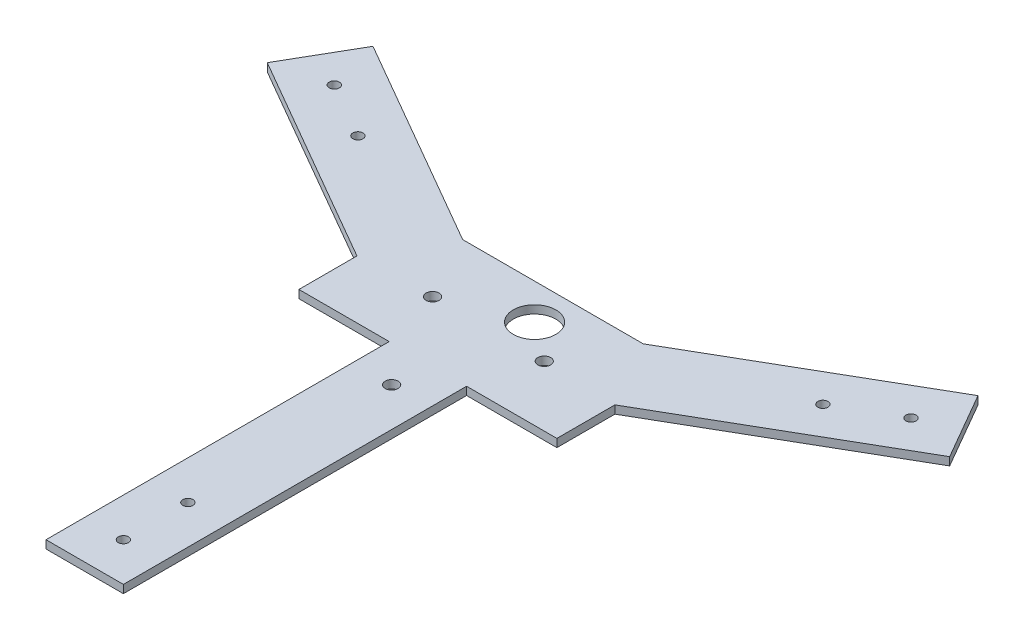
ISO-10303-21;
HEADER;
FILE_DESCRIPTION(('STEP AP214'),'2;1');
FILE_NAME('part.step','',(''),(''),'','','');
FILE_SCHEMA(('AUTOMOTIVE_DESIGN { 1 0 10303 214 1 1 1 1 }'));
ENDSEC;
DATA;
#1=APPLICATION_CONTEXT('core data for automotive mechanical design processes');
#2=APPLICATION_PROTOCOL_DEFINITION('international standard','automotive_design',2000,#1);
#3=PRODUCT_CONTEXT('',#1,'mechanical');
#4=PRODUCT('Part','Part','',(#3));
#5=PRODUCT_RELATED_PRODUCT_CATEGORY('part','',(#4));
#6=PRODUCT_DEFINITION_FORMATION('','',#4);
#7=PRODUCT_DEFINITION_CONTEXT('part definition',#1,'design');
#8=PRODUCT_DEFINITION('design','',#6,#7);
#9=PRODUCT_DEFINITION_SHAPE('','',#8);
#10=(LENGTH_UNIT() NAMED_UNIT(*) SI_UNIT(.MILLI.,.METRE.));
#11=(NAMED_UNIT(*) PLANE_ANGLE_UNIT() SI_UNIT($,.RADIAN.));
#12=(NAMED_UNIT(*) SI_UNIT($,.STERADIAN.) SOLID_ANGLE_UNIT());
#13=UNCERTAINTY_MEASURE_WITH_UNIT(LENGTH_MEASURE(1.E-05),#10,'distance_accuracy_value','');
#14=(GEOMETRIC_REPRESENTATION_CONTEXT(3) GLOBAL_UNCERTAINTY_ASSIGNED_CONTEXT((#13)) GLOBAL_UNIT_ASSIGNED_CONTEXT((#10,
#11,#12)) REPRESENTATION_CONTEXT('',''));
#15=CARTESIAN_POINT('',(0.,0.,0.));
#16=DIRECTION('',(0.,0.,1.));
#17=DIRECTION('',(1.,0.,0.));
#18=AXIS2_PLACEMENT_3D('',#15,#16,#17);
#19=CARTESIAN_POINT('',(50.8,1.5875,0.));
#20=DIRECTION('',(-1.,0.,0.));
#21=DIRECTION('',(0.,0.,1.));
#22=AXIS2_PLACEMENT_3D('',#19,#20,#21);
#23=PLANE('',#22);
#24=DIRECTION('',(0.,0.,-1.));
#25=VECTOR('',#24,1.);
#26=CARTESIAN_POINT('',(50.8,0.,0.));
#27=LINE('',#26,#25);
#28=CARTESIAN_POINT('',(50.8,0.,0.));
#29=VERTEX_POINT('',#28);
#30=CARTESIAN_POINT('',(50.8,0.,-11.43));
#31=VERTEX_POINT('',#30);
#32=EDGE_CURVE('E182',#29,#31,#27,.T.);
#33=ORIENTED_EDGE('',*,*,#32,.T.);
#34=DIRECTION('',(0.,-1.,0.));
#35=VECTOR('',#34,1.);
#36=CARTESIAN_POINT('',(50.8,1.5875,-11.43));
#37=LINE('',#36,#35);
#38=CARTESIAN_POINT('',(50.8,1.5875,-11.43));
#39=VERTEX_POINT('',#38);
#40=EDGE_CURVE('E11',#39,#31,#37,.T.);
#41=ORIENTED_EDGE('',*,*,#40,.F.);
#42=DIRECTION('',(0.,0.,-1.));
#43=VECTOR('',#42,1.);
#44=CARTESIAN_POINT('',(50.8,1.5875,0.));
#45=LINE('',#44,#43);
#46=CARTESIAN_POINT('',(50.8,1.5875,0.));
#47=VERTEX_POINT('',#46);
#48=EDGE_CURVE('E280',#47,#39,#45,.T.);
#49=ORIENTED_EDGE('',*,*,#48,.F.);
#50=DIRECTION('',(0.,-1.,0.));
#51=VECTOR('',#50,1.);
#52=CARTESIAN_POINT('',(50.8,1.5875,0.));
#53=LINE('',#52,#51);
#54=EDGE_CURVE('E178',#47,#29,#53,.T.);
#55=ORIENTED_EDGE('',*,*,#54,.T.);
#56=EDGE_LOOP('',(#33,#41,#49,#55));
#57=FACE_BOUND('',#56,.T.);
#58=ADVANCED_FACE('F37',(#57),#23,.F.);
#59=CARTESIAN_POINT('',(7.75066481737211,1.5875,13.4245452561249));
#60=DIRECTION('',(-0.500000000000004,0.,-0.866025403784436));
#61=DIRECTION('',(-0.866025403784436,0.,0.500000000000004));
#62=AXIS2_PLACEMENT_3D('',#59,#60,#61);
#63=PLANE('',#62);
#64=DIRECTION('',(0.866025403784436,0.,-0.500000000000004));
#65=VECTOR('',#64,1.);
#66=CARTESIAN_POINT('',(7.75066481737211,0.,13.4245452561249));
#67=LINE('',#66,#65);
#68=CARTESIAN_POINT('',(92.5943859866369,0.,-35.5600000000002));
#69=VERTEX_POINT('',#68);
#70=EDGE_CURVE('E186',#31,#69,#67,.T.);
#71=ORIENTED_EDGE('',*,*,#70,.T.);
#72=DIRECTION('',(0.,-1.,0.));
#73=VECTOR('',#72,1.);
#74=CARTESIAN_POINT('',(92.5943859866369,1.5875,-35.5600000000002));
#75=LINE('',#74,#73);
#76=CARTESIAN_POINT('',(92.5943859866369,1.5875,-35.5600000000002));
#77=VERTEX_POINT('',#76);
#78=EDGE_CURVE('E47',#77,#69,#75,.T.);
#79=ORIENTED_EDGE('',*,*,#78,.F.);
#80=DIRECTION('',(0.866025403784436,0.,-0.500000000000004));
#81=VECTOR('',#80,1.);
#82=CARTESIAN_POINT('',(7.75066481737211,1.5875,13.4245452561249));
#83=LINE('',#82,#81);
#84=EDGE_CURVE('E113',#39,#77,#83,.T.);
#85=ORIENTED_EDGE('',*,*,#84,.F.);
#86=ORIENTED_EDGE('',*,*,#40,.T.);
#87=EDGE_LOOP('',(#71,#79,#85,#86));
#88=FACE_BOUND('',#87,.T.);
#89=ADVANCED_FACE('F335',(#88),#63,.F.);
#90=CARTESIAN_POINT('',(84.8437211692649,1.5875,-48.9845452561249));
#91=DIRECTION('',(-0.866025403784437,0.,0.500000000000002));
#92=DIRECTION('',(0.500000000000002,0.,0.866025403784437));
#93=AXIS2_PLACEMENT_3D('',#90,#91,#92);
#94=PLANE('',#93);
#95=DIRECTION('',(-0.500000000000002,0.,-0.866025403784438));
#96=VECTOR('',#95,1.);
#97=CARTESIAN_POINT('',(84.8437211692649,0.,-48.9845452561249));
#98=LINE('',#97,#96);
#99=CARTESIAN_POINT('',(84.974385986637,0.,-48.7582271536748));
#100=VERTEX_POINT('',#99);
#101=EDGE_CURVE('E188',#69,#100,#98,.T.);
#102=ORIENTED_EDGE('',*,*,#101,.T.);
#103=DIRECTION('',(0.,-1.,0.));
#104=VECTOR('',#103,1.);
#105=CARTESIAN_POINT('',(84.974385986637,1.5875,-48.7582271536748));
#106=LINE('',#105,#104);
#107=CARTESIAN_POINT('',(84.974385986637,1.5875,-48.7582271536748));
#108=VERTEX_POINT('',#107);
#109=EDGE_CURVE('E241',#108,#100,#106,.T.);
#110=ORIENTED_EDGE('',*,*,#109,.F.);
#111=DIRECTION('',(-0.500000000000002,0.,-0.866025403784438));
#112=VECTOR('',#111,1.);
#113=CARTESIAN_POINT('',(84.8437211692649,1.5875,-48.9845452561249));
#114=LINE('',#113,#112);
#115=EDGE_CURVE('E283',#77,#108,#114,.T.);
#116=ORIENTED_EDGE('',*,*,#115,.F.);
#117=ORIENTED_EDGE('',*,*,#78,.T.);
#118=EDGE_LOOP('',(#102,#110,#116,#117));
#119=FACE_BOUND('',#118,.T.);
#120=ADVANCED_FACE('F339',(#119),#94,.F.);
#121=CARTESIAN_POINT('',(0.130664817371935,1.5875,0.2263181024499));
#122=DIRECTION('',(-0.5,0.,-0.866025403784439));
#123=DIRECTION('',(-0.866025403784439,0.,0.5));
#124=AXIS2_PLACEMENT_3D('',#121,#122,#123);
#125=PLANE('',#124);
#126=DIRECTION('',(0.866025403784439,0.,-0.5));
#127=VECTOR('',#126,1.);
#128=CARTESIAN_POINT('',(0.130664817371935,0.,0.2263181024499));
#129=LINE('',#128,#127);
#130=CARTESIAN_POINT('',(43.18,0.,-24.6282271536748));
#131=VERTEX_POINT('',#130);
#132=EDGE_CURVE('E191',#131,#100,#129,.T.);
#133=ORIENTED_EDGE('',*,*,#132,.F.);
#134=DIRECTION('',(0.,-1.,0.));
#135=VECTOR('',#134,1.);
#136=CARTESIAN_POINT('',(43.18,1.5875,-24.6282271536748));
#137=LINE('',#136,#135);
#138=CARTESIAN_POINT('',(43.18,1.5875,-24.6282271536748));
#139=VERTEX_POINT('',#138);
#140=EDGE_CURVE('E239',#139,#131,#137,.T.);
#141=ORIENTED_EDGE('',*,*,#140,.F.);
#142=DIRECTION('',(0.866025403784439,0.,-0.5));
#143=VECTOR('',#142,1.);
#144=CARTESIAN_POINT('',(0.130664817371935,1.5875,0.2263181024499));
#145=LINE('',#144,#143);
#146=EDGE_CURVE('E285',#139,#108,#145,.T.);
#147=ORIENTED_EDGE('',*,*,#146,.T.);
#148=ORIENTED_EDGE('',*,*,#109,.T.);
#149=EDGE_LOOP('',(#133,#141,#147,#148));
#150=FACE_BOUND('',#149,.T.);
#151=ADVANCED_FACE('F344',(#150),#125,.T.);
#152=CARTESIAN_POINT('',(0.,1.5875,-24.6282271536748));
#153=DIRECTION('',(0.,0.,-1.));
#154=DIRECTION('',(-1.,0.,0.));
#155=AXIS2_PLACEMENT_3D('',#152,#153,#154);
#156=PLANE('',#155);
#157=DIRECTION('',(1.,0.,0.));
#158=VECTOR('',#157,1.);
#159=CARTESIAN_POINT('',(0.,0.,-24.6282271536748));
#160=LINE('',#159,#158);
#161=CARTESIAN_POINT('',(7.62000000000002,0.,-24.6282271536748));
#162=VERTEX_POINT('',#161);
#163=EDGE_CURVE('E194',#162,#131,#160,.T.);
#164=ORIENTED_EDGE('',*,*,#163,.F.);
#165=DIRECTION('',(0.,-1.,0.));
#166=VECTOR('',#165,1.);
#167=CARTESIAN_POINT('',(7.62000000000002,1.5875,-24.6282271536748));
#168=LINE('',#167,#166);
#169=CARTESIAN_POINT('',(7.62000000000002,1.5875,-24.6282271536748));
#170=VERTEX_POINT('',#169);
#171=EDGE_CURVE('E237',#170,#162,#168,.T.);
#172=ORIENTED_EDGE('',*,*,#171,.F.);
#173=DIRECTION('',(1.,0.,0.));
#174=VECTOR('',#173,1.);
#175=CARTESIAN_POINT('',(0.,1.5875,-24.6282271536748));
#176=LINE('',#175,#174);
#177=EDGE_CURVE('E288',#170,#139,#176,.T.);
#178=ORIENTED_EDGE('',*,*,#177,.T.);
#179=ORIENTED_EDGE('',*,*,#140,.T.);
#180=EDGE_LOOP('',(#164,#172,#178,#179));
#181=FACE_BOUND('',#180,.T.);
#182=ADVANCED_FACE('F348',(#181),#156,.T.);
#183=CARTESIAN_POINT('',(12.5693351826281,1.5875,-21.7707271536748));
#184=DIRECTION('',(-0.500000000000001,0.,0.866025403784438));
#185=DIRECTION('',(0.866025403784438,0.,0.500000000000001));
#186=AXIS2_PLACEMENT_3D('',#183,#184,#185);
#187=PLANE('',#186);
#188=DIRECTION('',(-0.866025403784438,0.,-0.500000000000001));
#189=VECTOR('',#188,1.);
#190=CARTESIAN_POINT('',(12.5693351826281,0.,-21.7707271536748));
#191=LINE('',#190,#189);
#192=CARTESIAN_POINT('',(-34.174385986637,0.,-48.7582271536749));
#193=VERTEX_POINT('',#192);
#194=EDGE_CURVE('E197',#162,#193,#191,.T.);
#195=ORIENTED_EDGE('',*,*,#194,.T.);
#196=DIRECTION('',(0.,-1.,0.));
#197=VECTOR('',#196,1.);
#198=CARTESIAN_POINT('',(-34.174385986637,1.5875,-48.7582271536749));
#199=LINE('',#198,#197);
#200=CARTESIAN_POINT('',(-34.174385986637,1.5875,-48.7582271536749));
#201=VERTEX_POINT('',#200);
#202=EDGE_CURVE('E235',#201,#193,#199,.T.);
#203=ORIENTED_EDGE('',*,*,#202,.F.);
#204=DIRECTION('',(-0.866025403784438,0.,-0.500000000000001));
#205=VECTOR('',#204,1.);
#206=CARTESIAN_POINT('',(12.5693351826281,1.5875,-21.7707271536748));
#207=LINE('',#206,#205);
#208=EDGE_CURVE('E291',#170,#201,#207,.T.);
#209=ORIENTED_EDGE('',*,*,#208,.F.);
#210=ORIENTED_EDGE('',*,*,#171,.T.);
#211=EDGE_LOOP('',(#195,#203,#209,#210));
#212=FACE_BOUND('',#211,.T.);
#213=ADVANCED_FACE('F352',(#212),#187,.F.);
#214=CARTESIAN_POINT('',(-46.7437211692651,1.5875,-26.9875000000001));
#215=DIRECTION('',(-0.866025403784438,0.,-0.500000000000001));
#216=DIRECTION('',(-0.500000000000001,0.,0.866025403784438));
#217=AXIS2_PLACEMENT_3D('',#214,#215,#216);
#218=PLANE('',#217);
#219=DIRECTION('',(0.500000000000001,0.,-0.866025403784438));
#220=VECTOR('',#219,1.);
#221=CARTESIAN_POINT('',(-46.7437211692651,0.,-26.9875000000001));
#222=LINE('',#221,#220);
#223=CARTESIAN_POINT('',(-41.794385986637,0.,-35.5600000000001));
#224=VERTEX_POINT('',#223);
#225=EDGE_CURVE('E200',#224,#193,#222,.T.);
#226=ORIENTED_EDGE('',*,*,#225,.F.);
#227=DIRECTION('',(0.,-1.,0.));
#228=VECTOR('',#227,1.);
#229=CARTESIAN_POINT('',(-41.794385986637,1.5875,-35.5600000000001));
#230=LINE('',#229,#228);
#231=CARTESIAN_POINT('',(-41.794385986637,1.5875,-35.5600000000001));
#232=VERTEX_POINT('',#231);
#233=EDGE_CURVE('E233',#232,#224,#230,.T.);
#234=ORIENTED_EDGE('',*,*,#233,.F.);
#235=DIRECTION('',(0.500000000000001,0.,-0.866025403784438));
#236=VECTOR('',#235,1.);
#237=CARTESIAN_POINT('',(-46.7437211692651,1.5875,-26.9875000000001));
#238=LINE('',#237,#236);
#239=EDGE_CURVE('E293',#232,#201,#238,.T.);
#240=ORIENTED_EDGE('',*,*,#239,.T.);
#241=ORIENTED_EDGE('',*,*,#202,.T.);
#242=EDGE_LOOP('',(#226,#234,#240,#241));
#243=FACE_BOUND('',#242,.T.);
#244=ADVANCED_FACE('F356',(#243),#218,.T.);
#245=CARTESIAN_POINT('',(4.94933518262808,1.5875,-8.57249999999998));
#246=DIRECTION('',(-0.500000000000001,0.,0.866025403784438));
#247=DIRECTION('',(0.866025403784438,0.,0.500000000000002));
#248=AXIS2_PLACEMENT_3D('',#245,#246,#247);
#249=PLANE('',#248);
#250=DIRECTION('',(-0.866025403784438,0.,-0.500000000000001));
#251=VECTOR('',#250,1.);
#252=CARTESIAN_POINT('',(4.94933518262808,0.,-8.57249999999998));
#253=LINE('',#252,#251);
#254=CARTESIAN_POINT('',(0.,0.,-11.43));
#255=VERTEX_POINT('',#254);
#256=EDGE_CURVE('E203',#255,#224,#253,.T.);
#257=ORIENTED_EDGE('',*,*,#256,.F.);
#258=DIRECTION('',(0.,-1.,0.));
#259=VECTOR('',#258,1.);
#260=CARTESIAN_POINT('',(0.,1.5875,-11.43));
#261=LINE('',#260,#259);
#262=CARTESIAN_POINT('',(0.,1.5875,-11.43));
#263=VERTEX_POINT('',#262);
#264=EDGE_CURVE('E231',#263,#255,#261,.T.);
#265=ORIENTED_EDGE('',*,*,#264,.F.);
#266=DIRECTION('',(-0.866025403784438,0.,-0.500000000000001));
#267=VECTOR('',#266,1.);
#268=CARTESIAN_POINT('',(4.94933518262808,1.5875,-8.57249999999998));
#269=LINE('',#268,#267);
#270=EDGE_CURVE('E296',#263,#232,#269,.T.);
#271=ORIENTED_EDGE('',*,*,#270,.T.);
#272=ORIENTED_EDGE('',*,*,#233,.T.);
#273=EDGE_LOOP('',(#257,#265,#271,#272));
#274=FACE_BOUND('',#273,.T.);
#275=ADVANCED_FACE('F360',(#274),#249,.T.);
#276=CARTESIAN_POINT('',(0.,1.5875,0.));
#277=DIRECTION('',(-1.,0.,0.));
#278=DIRECTION('',(0.,0.,1.));
#279=AXIS2_PLACEMENT_3D('',#276,#277,#278);
#280=PLANE('',#279);
#281=DIRECTION('',(0.,0.,-1.));
#282=VECTOR('',#281,1.);
#283=CARTESIAN_POINT('',(0.,0.,0.));
#284=LINE('',#283,#282);
#285=CARTESIAN_POINT('',(0.,0.,0.));
#286=VERTEX_POINT('',#285);
#287=EDGE_CURVE('E206',#286,#255,#284,.T.);
#288=ORIENTED_EDGE('',*,*,#287,.F.);
#289=DIRECTION('',(0.,-1.,0.));
#290=VECTOR('',#289,1.);
#291=CARTESIAN_POINT('',(0.,1.5875,0.));
#292=LINE('',#291,#290);
#293=CARTESIAN_POINT('',(0.,1.5875,0.));
#294=VERTEX_POINT('',#293);
#295=EDGE_CURVE('E229',#294,#286,#292,.T.);
#296=ORIENTED_EDGE('',*,*,#295,.F.);
#297=DIRECTION('',(0.,0.,-1.));
#298=VECTOR('',#297,1.);
#299=CARTESIAN_POINT('',(0.,1.5875,0.));
#300=LINE('',#299,#298);
#301=EDGE_CURVE('E299',#294,#263,#300,.T.);
#302=ORIENTED_EDGE('',*,*,#301,.T.);
#303=ORIENTED_EDGE('',*,*,#264,.T.);
#304=EDGE_LOOP('',(#288,#296,#302,#303));
#305=FACE_BOUND('',#304,.T.);
#306=ADVANCED_FACE('F333',(#305),#280,.T.);
#307=CARTESIAN_POINT('',(0.,1.5875,0.));
#308=DIRECTION('',(0.,0.,-1.));
#309=DIRECTION('',(-1.,0.,0.));
#310=AXIS2_PLACEMENT_3D('',#307,#308,#309);
#311=PLANE('',#310);
#312=DIRECTION('',(1.,0.,0.));
#313=VECTOR('',#312,1.);
#314=CARTESIAN_POINT('',(0.,0.,0.));
#315=LINE('',#314,#313);
#316=CARTESIAN_POINT('',(17.78,0.,0.));
#317=VERTEX_POINT('',#316);
#318=EDGE_CURVE('E209',#286,#317,#315,.T.);
#319=ORIENTED_EDGE('',*,*,#318,.T.);
#320=DIRECTION('',(0.,-1.,0.));
#321=VECTOR('',#320,1.);
#322=CARTESIAN_POINT('',(17.78,1.5875,0.));
#323=LINE('',#322,#321);
#324=CARTESIAN_POINT('',(17.78,1.5875,0.));
#325=VERTEX_POINT('',#324);
#326=EDGE_CURVE('E226',#325,#317,#323,.T.);
#327=ORIENTED_EDGE('',*,*,#326,.F.);
#328=DIRECTION('',(1.,0.,0.));
#329=VECTOR('',#328,1.);
#330=CARTESIAN_POINT('',(0.,1.5875,0.));
#331=LINE('',#330,#329);
#332=EDGE_CURVE('E170',#294,#325,#331,.T.);
#333=ORIENTED_EDGE('',*,*,#332,.F.);
#334=ORIENTED_EDGE('',*,*,#295,.T.);
#335=EDGE_LOOP('',(#319,#327,#333,#334));
#336=FACE_BOUND('',#335,.T.);
#337=ADVANCED_FACE('F306',(#336),#311,.F.);
#338=CARTESIAN_POINT('',(17.78,1.5875,0.));
#339=DIRECTION('',(1.,0.,0.));
#340=DIRECTION('',(0.,0.,-1.));
#341=AXIS2_PLACEMENT_3D('',#338,#339,#340);
#342=PLANE('',#341);
#343=DIRECTION('',(0.,0.,1.));
#344=VECTOR('',#343,1.);
#345=CARTESIAN_POINT('',(17.78,0.,0.));
#346=LINE('',#345,#344);
#347=CARTESIAN_POINT('',(17.78,0.,67.5878787349666));
#348=VERTEX_POINT('',#347);
#349=EDGE_CURVE('E211',#317,#348,#346,.T.);
#350=ORIENTED_EDGE('',*,*,#349,.T.);
#351=DIRECTION('',(0.,-1.,0.));
#352=VECTOR('',#351,1.);
#353=CARTESIAN_POINT('',(17.78,1.5875,67.5878787349666));
#354=LINE('',#353,#352);
#355=CARTESIAN_POINT('',(17.78,1.5875,67.5878787349666));
#356=VERTEX_POINT('',#355);
#357=EDGE_CURVE('E164',#356,#348,#354,.T.);
#358=ORIENTED_EDGE('',*,*,#357,.F.);
#359=DIRECTION('',(0.,0.,1.));
#360=VECTOR('',#359,1.);
#361=CARTESIAN_POINT('',(17.78,1.5875,0.));
#362=LINE('',#361,#360);
#363=EDGE_CURVE('E151',#325,#356,#362,.T.);
#364=ORIENTED_EDGE('',*,*,#363,.F.);
#365=ORIENTED_EDGE('',*,*,#326,.T.);
#366=EDGE_LOOP('',(#350,#358,#364,#365));
#367=FACE_BOUND('',#366,.T.);
#368=ADVANCED_FACE('F310',(#367),#342,.F.);
#369=CARTESIAN_POINT('',(0.,1.5875,67.5878787349666));
#370=DIRECTION('',(0.,0.,-1.));
#371=DIRECTION('',(-1.,0.,0.));
#372=AXIS2_PLACEMENT_3D('',#369,#370,#371);
#373=PLANE('',#372);
#374=DIRECTION('',(1.,0.,0.));
#375=VECTOR('',#374,1.);
#376=CARTESIAN_POINT('',(0.,0.,67.5878787349666));
#377=LINE('',#376,#375);
#378=CARTESIAN_POINT('',(33.02,0.,67.5878787349666));
#379=VERTEX_POINT('',#378);
#380=EDGE_CURVE('E160',#348,#379,#377,.T.);
#381=ORIENTED_EDGE('',*,*,#380,.T.);
#382=DIRECTION('',(0.,-1.,0.));
#383=VECTOR('',#382,1.);
#384=CARTESIAN_POINT('',(33.02,1.5875,67.5878787349666));
#385=LINE('',#384,#383);
#386=CARTESIAN_POINT('',(33.02,1.5875,67.5878787349666));
#387=VERTEX_POINT('',#386);
#388=EDGE_CURVE('E157',#387,#379,#385,.T.);
#389=ORIENTED_EDGE('',*,*,#388,.F.);
#390=DIRECTION('',(1.,0.,0.));
#391=VECTOR('',#390,1.);
#392=CARTESIAN_POINT('',(0.,1.5875,67.5878787349666));
#393=LINE('',#392,#391);
#394=EDGE_CURVE('E144',#356,#387,#393,.T.);
#395=ORIENTED_EDGE('',*,*,#394,.F.);
#396=ORIENTED_EDGE('',*,*,#357,.T.);
#397=EDGE_LOOP('',(#381,#389,#395,#396));
#398=FACE_BOUND('',#397,.T.);
#399=ADVANCED_FACE('F158',(#398),#373,.F.);
#400=CARTESIAN_POINT('',(33.02,1.5875,0.));
#401=DIRECTION('',(1.,0.,0.));
#402=DIRECTION('',(0.,0.,-1.));
#403=AXIS2_PLACEMENT_3D('',#400,#401,#402);
#404=PLANE('',#403);
#405=DIRECTION('',(0.,0.,1.));
#406=VECTOR('',#405,1.);
#407=CARTESIAN_POINT('',(33.02,0.,0.));
#408=LINE('',#407,#406);
#409=CARTESIAN_POINT('',(33.02,0.,0.));
#410=VERTEX_POINT('',#409);
#411=EDGE_CURVE('E214',#410,#379,#408,.T.);
#412=ORIENTED_EDGE('',*,*,#411,.F.);
#413=DIRECTION('',(0.,-1.,0.));
#414=VECTOR('',#413,1.);
#415=CARTESIAN_POINT('',(33.02,1.5875,0.));
#416=LINE('',#415,#414);
#417=CARTESIAN_POINT('',(33.02,1.5875,0.));
#418=VERTEX_POINT('',#417);
#419=EDGE_CURVE('E102',#418,#410,#416,.T.);
#420=ORIENTED_EDGE('',*,*,#419,.F.);
#421=DIRECTION('',(0.,0.,1.));
#422=VECTOR('',#421,1.);
#423=CARTESIAN_POINT('',(33.02,1.5875,0.));
#424=LINE('',#423,#422);
#425=EDGE_CURVE('E149',#418,#387,#424,.T.);
#426=ORIENTED_EDGE('',*,*,#425,.T.);
#427=ORIENTED_EDGE('',*,*,#388,.T.);
#428=EDGE_LOOP('',(#412,#420,#426,#427));
#429=FACE_BOUND('',#428,.T.);
#430=ADVANCED_FACE('F166',(#429),#404,.T.);
#431=CARTESIAN_POINT('',(36.3985226280624,1.5875,-11.9141212650334));
#432=DIRECTION('',(0.,-1.,0.));
#433=DIRECTION('',(0.,0.,-1.));
#434=AXIS2_PLACEMENT_3D('',#431,#432,#433);
#435=CYLINDRICAL_SURFACE('',#434,1.27);
#436=CARTESIAN_POINT('',(36.3985226280624,1.5875,-11.9141212650334));
#437=DIRECTION('',(0.,1.,0.));
#438=DIRECTION('',(0.,0.,1.));
#439=AXIS2_PLACEMENT_3D('',#436,#437,#438);
#440=CIRCLE('',#439,1.27);
#441=CARTESIAN_POINT('',(36.3985226280624,1.5875,-10.6441212650334));
#442=VERTEX_POINT('',#441);
#443=EDGE_CURVE('E168',#442,#442,#440,.T.);
#444=ORIENTED_EDGE('',*,*,#443,.T.);
#445=EDGE_LOOP('',(#444));
#446=FACE_BOUND('',#445,.T.);
#447=CARTESIAN_POINT('',(36.3985226280624,0.,-11.9141212650334));
#448=DIRECTION('',(0.,1.,0.));
#449=DIRECTION('',(0.,0.,1.));
#450=AXIS2_PLACEMENT_3D('',#447,#448,#449);
#451=CIRCLE('',#450,1.27);
#452=CARTESIAN_POINT('',(36.3985226280624,0.,-10.6441212650334));
#453=VERTEX_POINT('',#452);
#454=EDGE_CURVE('E216',#453,#453,#451,.T.);
#455=ORIENTED_EDGE('',*,*,#454,.F.);
#456=EDGE_LOOP('',(#455));
#457=FACE_BOUND('',#456,.T.);
#458=ADVANCED_FACE('F321',(#446,#457),#435,.F.);
#459=EDGE_CURVE('E105',#410,#29,#315,.T.);
#460=ORIENTED_EDGE('',*,*,#459,.T.);
#461=ORIENTED_EDGE('',*,*,#54,.F.);
#462=EDGE_CURVE('E56',#418,#47,#331,.T.);
#463=ORIENTED_EDGE('',*,*,#462,.F.);
#464=ORIENTED_EDGE('',*,*,#419,.T.);
#465=EDGE_LOOP('',(#460,#461,#463,#464));
#466=FACE_BOUND('',#465,.T.);
#467=ADVANCED_FACE('F319',(#466),#311,.F.);
#468=CARTESIAN_POINT('',(14.4014773719377,1.5875,-11.9141212650334));
#469=DIRECTION('',(0.,-1.,0.));
#470=DIRECTION('',(0.,0.,-1.));
#471=AXIS2_PLACEMENT_3D('',#468,#469,#470);
#472=CYLINDRICAL_SURFACE('',#471,1.27000000000001);
#473=CARTESIAN_POINT('',(14.4014773719377,1.5875,-11.9141212650334));
#474=DIRECTION('',(0.,1.,0.));
#475=DIRECTION('',(0.,0.,1.));
#476=AXIS2_PLACEMENT_3D('',#473,#474,#475);
#477=CIRCLE('',#476,1.27000000000001);
#478=CARTESIAN_POINT('',(14.4014773719377,1.5875,-10.6441212650334));
#479=VERTEX_POINT('',#478);
#480=EDGE_CURVE('E222',#479,#479,#477,.T.);
#481=ORIENTED_EDGE('',*,*,#480,.T.);
#482=EDGE_LOOP('',(#481));
#483=FACE_BOUND('',#482,.T.);
#484=CARTESIAN_POINT('',(14.4014773719377,0.,-11.9141212650334));
#485=DIRECTION('',(0.,1.,0.));
#486=DIRECTION('',(0.,0.,1.));
#487=AXIS2_PLACEMENT_3D('',#484,#485,#486);
#488=CIRCLE('',#487,1.27000000000001);
#489=CARTESIAN_POINT('',(14.4014773719377,0.,-10.6441212650334));
#490=VERTEX_POINT('',#489);
#491=EDGE_CURVE('E179',#490,#490,#488,.T.);
#492=ORIENTED_EDGE('',*,*,#491,.F.);
#493=EDGE_LOOP('',(#492));
#494=FACE_BOUND('',#493,.T.);
#495=ADVANCED_FACE('F39',(#483,#494),#472,.F.);
#496=CARTESIAN_POINT('',(25.4,1.5875,7.13587873496665));
#497=DIRECTION('',(0.,-1.,0.));
#498=DIRECTION('',(0.,0.,-1.));
#499=AXIS2_PLACEMENT_3D('',#496,#497,#498);
#500=CYLINDRICAL_SURFACE('',#499,1.27);
#501=CARTESIAN_POINT('',(25.4,1.5875,7.13587873496665));
#502=DIRECTION('',(0.,1.,0.));
#503=DIRECTION('',(0.,0.,1.));
#504=AXIS2_PLACEMENT_3D('',#501,#502,#503);
#505=CIRCLE('',#504,1.27);
#506=CARTESIAN_POINT('',(25.4,1.5875,8.40587873496665));
#507=VERTEX_POINT('',#506);
#508=EDGE_CURVE('E175',#507,#507,#505,.T.);
#509=ORIENTED_EDGE('',*,*,#508,.T.);
#510=EDGE_LOOP('',(#509));
#511=FACE_BOUND('',#510,.T.);
#512=CARTESIAN_POINT('',(25.4,0.,7.13587873496665));
#513=DIRECTION('',(0.,1.,0.));
#514=DIRECTION('',(0.,0.,1.));
#515=AXIS2_PLACEMENT_3D('',#512,#513,#514);
#516=CIRCLE('',#515,1.27);
#517=CARTESIAN_POINT('',(25.4,0.,8.40587873496665));
#518=VERTEX_POINT('',#517);
#519=EDGE_CURVE('E219',#518,#518,#516,.T.);
#520=ORIENTED_EDGE('',*,*,#519,.F.);
#521=EDGE_LOOP('',(#520));
#522=FACE_BOUND('',#521,.T.);
#523=ADVANCED_FACE('F327',(#511,#522),#500,.F.);
#524=CARTESIAN_POINT('',(0.,1.5875,0.));
#525=DIRECTION('',(0.,1.,0.));
#526=DIRECTION('',(0.,0.,1.));
#527=AXIS2_PLACEMENT_3D('',#524,#525,#526);
#528=PLANE('',#527);
#529=CARTESIAN_POINT('',(71.1867497817372,1.5875,-31.9991135768374));
#530=DIRECTION('',(0.,1.,0.));
#531=DIRECTION('',(0.,0.,1.));
#532=AXIS2_PLACEMENT_3D('',#529,#530,#531);
#533=CIRCLE('',#532,0.999999999999998);
#534=CARTESIAN_POINT('',(71.1867497817372,1.5875,-30.9991135768374));
#535=VERTEX_POINT('',#534);
#536=EDGE_CURVE('E490',#535,#535,#533,.T.);
#537=ORIENTED_EDGE('',*,*,#536,.F.);
#538=EDGE_LOOP('',(#537));
#539=FACE_BOUND('',#538,.T.);
#540=CARTESIAN_POINT('',(82.1852724097996,1.5875,-38.3491135768374));
#541=DIRECTION('',(0.,1.,0.));
#542=DIRECTION('',(0.,0.,1.));
#543=AXIS2_PLACEMENT_3D('',#540,#541,#542);
#544=CIRCLE('',#543,0.999999999999998);
#545=CARTESIAN_POINT('',(82.1852724097996,1.5875,-37.3491135768374));
#546=VERTEX_POINT('',#545);
#547=EDGE_CURVE('E491',#546,#546,#544,.T.);
#548=ORIENTED_EDGE('',*,*,#547,.F.);
#549=EDGE_LOOP('',(#548));
#550=FACE_BOUND('',#549,.T.);
#551=CARTESIAN_POINT('',(-31.3852724097996,1.5875,-38.3491135768374));
#552=DIRECTION('',(0.,1.,0.));
#553=DIRECTION('',(0.,0.,1.));
#554=AXIS2_PLACEMENT_3D('',#551,#552,#553);
#555=CIRCLE('',#554,1.);
#556=CARTESIAN_POINT('',(-31.3852724097996,1.5875,-37.3491135768374));
#557=VERTEX_POINT('',#556);
#558=EDGE_CURVE('E494',#557,#557,#555,.T.);
#559=ORIENTED_EDGE('',*,*,#558,.F.);
#560=EDGE_LOOP('',(#559));
#561=FACE_BOUND('',#560,.T.);
#562=CARTESIAN_POINT('',(-20.3867497817372,1.5875,-31.9991135768374));
#563=DIRECTION('',(0.,1.,0.));
#564=DIRECTION('',(0.,0.,1.));
#565=AXIS2_PLACEMENT_3D('',#562,#563,#564);
#566=CIRCLE('',#565,1.);
#567=CARTESIAN_POINT('',(-20.3867497817372,1.5875,-30.9991135768374));
#568=VERTEX_POINT('',#567);
#569=EDGE_CURVE('E274',#568,#568,#566,.T.);
#570=ORIENTED_EDGE('',*,*,#569,.F.);
#571=EDGE_LOOP('',(#570));
#572=FACE_BOUND('',#571,.T.);
#573=CARTESIAN_POINT('',(25.4,1.5875,47.2678787349666));
#574=DIRECTION('',(0.,1.,0.));
#575=DIRECTION('',(0.,0.,1.));
#576=AXIS2_PLACEMENT_3D('',#573,#574,#575);
#577=CIRCLE('',#576,0.999997999999997);
#578=CARTESIAN_POINT('',(25.4,1.5875,48.2678767349666));
#579=VERTEX_POINT('',#578);
#580=EDGE_CURVE('E256',#579,#579,#577,.T.);
#581=ORIENTED_EDGE('',*,*,#580,.F.);
#582=EDGE_LOOP('',(#581));
#583=FACE_BOUND('',#582,.T.);
#584=CARTESIAN_POINT('',(25.4,1.5875,59.9678787349666));
#585=DIRECTION('',(0.,1.,0.));
#586=DIRECTION('',(0.,0.,1.));
#587=AXIS2_PLACEMENT_3D('',#584,#585,#586);
#588=CIRCLE('',#587,1.);
#589=CARTESIAN_POINT('',(25.4,1.5875,60.9678787349666));
#590=VERTEX_POINT('',#589);
#591=EDGE_CURVE('E251',#590,#590,#588,.T.);
#592=ORIENTED_EDGE('',*,*,#591,.F.);
#593=EDGE_LOOP('',(#592));
#594=FACE_BOUND('',#593,.T.);
#595=CARTESIAN_POINT('',(28.7785226280624,1.5875,-17.6279871536748));
#596=DIRECTION('',(0.,1.,0.));
#597=DIRECTION('',(0.,0.,1.));
#598=AXIS2_PLACEMENT_3D('',#595,#596,#597);
#599=CIRCLE('',#598,4.19100000000001);
#600=CARTESIAN_POINT('',(28.7785226280624,1.5875,-13.4369871536748));
#601=VERTEX_POINT('',#600);
#602=EDGE_CURVE('E247',#601,#601,#599,.T.);
#603=ORIENTED_EDGE('',*,*,#602,.F.);
#604=EDGE_LOOP('',(#603));
#605=FACE_BOUND('',#604,.T.);
#606=ORIENTED_EDGE('',*,*,#480,.F.);
#607=EDGE_LOOP('',(#606));
#608=FACE_BOUND('',#607,.T.);
#609=ORIENTED_EDGE('',*,*,#48,.T.);
#610=ORIENTED_EDGE('',*,*,#84,.T.);
#611=ORIENTED_EDGE('',*,*,#115,.T.);
#612=ORIENTED_EDGE('',*,*,#146,.F.);
#613=ORIENTED_EDGE('',*,*,#177,.F.);
#614=ORIENTED_EDGE('',*,*,#208,.T.);
#615=ORIENTED_EDGE('',*,*,#239,.F.);
#616=ORIENTED_EDGE('',*,*,#270,.F.);
#617=ORIENTED_EDGE('',*,*,#301,.F.);
#618=ORIENTED_EDGE('',*,*,#332,.T.);
#619=ORIENTED_EDGE('',*,*,#363,.T.);
#620=ORIENTED_EDGE('',*,*,#394,.T.);
#621=ORIENTED_EDGE('',*,*,#425,.F.);
#622=ORIENTED_EDGE('',*,*,#462,.T.);
#623=EDGE_LOOP('',(#609,#610,#611,#612,#613,#614,#615,#616,#617,#618,#619,#620,#621,#622));
#624=FACE_BOUND('',#623,.T.);
#625=ORIENTED_EDGE('',*,*,#443,.F.);
#626=EDGE_LOOP('',(#625));
#627=FACE_BOUND('',#626,.T.);
#628=ORIENTED_EDGE('',*,*,#508,.F.);
#629=EDGE_LOOP('',(#628));
#630=FACE_BOUND('',#629,.T.);
#631=ADVANCED_FACE('F146',(#539,#550,#561,#572,#583,#594,#605,#608,#624,#627,#630),#528,.T.);
#632=CARTESIAN_POINT('',(0.,0.,0.));
#633=DIRECTION('',(0.,1.,0.));
#634=DIRECTION('',(0.,0.,1.));
#635=AXIS2_PLACEMENT_3D('',#632,#633,#634);
#636=PLANE('',#635);
#637=CARTESIAN_POINT('',(71.1867497817372,0.,-31.9991135768374));
#638=DIRECTION('',(0.,1.,0.));
#639=DIRECTION('',(0.,0.,1.));
#640=AXIS2_PLACEMENT_3D('',#637,#638,#639);
#641=CIRCLE('',#640,0.999999999999998);
#642=CARTESIAN_POINT('',(71.1867497817372,0.,-30.9991135768374));
#643=VERTEX_POINT('',#642);
#644=EDGE_CURVE('E41',#643,#643,#641,.T.);
#645=ORIENTED_EDGE('',*,*,#644,.T.);
#646=EDGE_LOOP('',(#645));
#647=FACE_BOUND('',#646,.T.);
#648=CARTESIAN_POINT('',(82.1852724097996,0.,-38.3491135768374));
#649=DIRECTION('',(0.,1.,0.));
#650=DIRECTION('',(0.,0.,1.));
#651=AXIS2_PLACEMENT_3D('',#648,#649,#650);
#652=CIRCLE('',#651,0.999999999999998);
#653=CARTESIAN_POINT('',(82.1852724097996,0.,-37.3491135768374));
#654=VERTEX_POINT('',#653);
#655=EDGE_CURVE('E261',#654,#654,#652,.T.);
#656=ORIENTED_EDGE('',*,*,#655,.T.);
#657=EDGE_LOOP('',(#656));
#658=FACE_BOUND('',#657,.T.);
#659=CARTESIAN_POINT('',(-31.3852724097996,0.,-38.3491135768374));
#660=DIRECTION('',(0.,1.,0.));
#661=DIRECTION('',(0.,0.,1.));
#662=AXIS2_PLACEMENT_3D('',#659,#660,#661);
#663=CIRCLE('',#662,1.);
#664=CARTESIAN_POINT('',(-31.3852724097996,0.,-37.3491135768374));
#665=VERTEX_POINT('',#664);
#666=EDGE_CURVE('E259',#665,#665,#663,.T.);
#667=ORIENTED_EDGE('',*,*,#666,.T.);
#668=EDGE_LOOP('',(#667));
#669=FACE_BOUND('',#668,.T.);
#670=CARTESIAN_POINT('',(-20.3867497817372,0.,-31.9991135768374));
#671=DIRECTION('',(0.,1.,0.));
#672=DIRECTION('',(0.,0.,1.));
#673=AXIS2_PLACEMENT_3D('',#670,#671,#672);
#674=CIRCLE('',#673,1.);
#675=CARTESIAN_POINT('',(-20.3867497817372,0.,-30.9991135768374));
#676=VERTEX_POINT('',#675);
#677=EDGE_CURVE('E255',#676,#676,#674,.T.);
#678=ORIENTED_EDGE('',*,*,#677,.T.);
#679=EDGE_LOOP('',(#678));
#680=FACE_BOUND('',#679,.T.);
#681=CARTESIAN_POINT('',(25.4,0.,47.2678787349666));
#682=DIRECTION('',(0.,1.,0.));
#683=DIRECTION('',(0.,0.,1.));
#684=AXIS2_PLACEMENT_3D('',#681,#682,#683);
#685=CIRCLE('',#684,0.999997999999997);
#686=CARTESIAN_POINT('',(25.4,0.,48.2678767349666));
#687=VERTEX_POINT('',#686);
#688=EDGE_CURVE('E252',#687,#687,#685,.T.);
#689=ORIENTED_EDGE('',*,*,#688,.T.);
#690=EDGE_LOOP('',(#689));
#691=FACE_BOUND('',#690,.T.);
#692=CARTESIAN_POINT('',(25.4,0.,59.9678787349666));
#693=DIRECTION('',(0.,1.,0.));
#694=DIRECTION('',(0.,0.,1.));
#695=AXIS2_PLACEMENT_3D('',#692,#693,#694);
#696=CIRCLE('',#695,1.);
#697=CARTESIAN_POINT('',(25.4,0.,60.9678787349666));
#698=VERTEX_POINT('',#697);
#699=EDGE_CURVE('E248',#698,#698,#696,.T.);
#700=ORIENTED_EDGE('',*,*,#699,.T.);
#701=EDGE_LOOP('',(#700));
#702=FACE_BOUND('',#701,.T.);
#703=CARTESIAN_POINT('',(28.7785226280624,0.,-17.6279871536748));
#704=DIRECTION('',(0.,1.,0.));
#705=DIRECTION('',(0.,0.,1.));
#706=AXIS2_PLACEMENT_3D('',#703,#704,#705);
#707=CIRCLE('',#706,4.19100000000001);
#708=CARTESIAN_POINT('',(28.7785226280624,0.,-13.4369871536748));
#709=VERTEX_POINT('',#708);
#710=EDGE_CURVE('E183',#709,#709,#707,.T.);
#711=ORIENTED_EDGE('',*,*,#710,.T.);
#712=EDGE_LOOP('',(#711));
#713=FACE_BOUND('',#712,.T.);
#714=ORIENTED_EDGE('',*,*,#491,.T.);
#715=EDGE_LOOP('',(#714));
#716=FACE_BOUND('',#715,.T.);
#717=ORIENTED_EDGE('',*,*,#32,.F.);
#718=ORIENTED_EDGE('',*,*,#459,.F.);
#719=ORIENTED_EDGE('',*,*,#411,.T.);
#720=ORIENTED_EDGE('',*,*,#380,.F.);
#721=ORIENTED_EDGE('',*,*,#349,.F.);
#722=ORIENTED_EDGE('',*,*,#318,.F.);
#723=ORIENTED_EDGE('',*,*,#287,.T.);
#724=ORIENTED_EDGE('',*,*,#256,.T.);
#725=ORIENTED_EDGE('',*,*,#225,.T.);
#726=ORIENTED_EDGE('',*,*,#194,.F.);
#727=ORIENTED_EDGE('',*,*,#163,.T.);
#728=ORIENTED_EDGE('',*,*,#132,.T.);
#729=ORIENTED_EDGE('',*,*,#101,.F.);
#730=ORIENTED_EDGE('',*,*,#70,.F.);
#731=EDGE_LOOP('',(#717,#718,#719,#720,#721,#722,#723,#724,#725,#726,#727,#728,#729,#730));
#732=FACE_BOUND('',#731,.T.);
#733=ORIENTED_EDGE('',*,*,#454,.T.);
#734=EDGE_LOOP('',(#733));
#735=FACE_BOUND('',#734,.T.);
#736=ORIENTED_EDGE('',*,*,#519,.T.);
#737=EDGE_LOOP('',(#736));
#738=FACE_BOUND('',#737,.T.);
#739=ADVANCED_FACE('F313',(#647,#658,#669,#680,#691,#702,#713,#716,#732,#735,#738),#636,.F.);
#740=CARTESIAN_POINT('',(28.7785226280624,-0.9525,-17.6279871536748));
#741=DIRECTION('',(0.,1.,0.));
#742=DIRECTION('',(0.,0.,1.));
#743=AXIS2_PLACEMENT_3D('',#740,#741,#742);
#744=CYLINDRICAL_SURFACE('',#743,4.19100000000001);
#745=ORIENTED_EDGE('',*,*,#602,.T.);
#746=EDGE_LOOP('',(#745));
#747=FACE_BOUND('',#746,.T.);
#748=ORIENTED_EDGE('',*,*,#710,.F.);
#749=EDGE_LOOP('',(#748));
#750=FACE_BOUND('',#749,.T.);
#751=ADVANCED_FACE('F407',(#747,#750),#744,.F.);
#752=CARTESIAN_POINT('',(25.4,-0.9525,59.9678787349666));
#753=DIRECTION('',(0.,1.,0.));
#754=DIRECTION('',(0.,0.,1.));
#755=AXIS2_PLACEMENT_3D('',#752,#753,#754);
#756=CYLINDRICAL_SURFACE('',#755,1.);
#757=ORIENTED_EDGE('',*,*,#591,.T.);
#758=EDGE_LOOP('',(#757));
#759=FACE_BOUND('',#758,.T.);
#760=ORIENTED_EDGE('',*,*,#699,.F.);
#761=EDGE_LOOP('',(#760));
#762=FACE_BOUND('',#761,.T.);
#763=ADVANCED_FACE('F412',(#759,#762),#756,.F.);
#764=CARTESIAN_POINT('',(25.4,-0.9525,47.2678787349666));
#765=DIRECTION('',(0.,1.,0.));
#766=DIRECTION('',(0.,0.,1.));
#767=AXIS2_PLACEMENT_3D('',#764,#765,#766);
#768=CYLINDRICAL_SURFACE('',#767,0.999997999999997);
#769=ORIENTED_EDGE('',*,*,#580,.T.);
#770=EDGE_LOOP('',(#769));
#771=FACE_BOUND('',#770,.T.);
#772=ORIENTED_EDGE('',*,*,#688,.F.);
#773=EDGE_LOOP('',(#772));
#774=FACE_BOUND('',#773,.T.);
#775=ADVANCED_FACE('F434',(#771,#774),#768,.F.);
#776=CARTESIAN_POINT('',(-20.3867497817372,-0.9525,-31.9991135768374));
#777=DIRECTION('',(0.,1.,0.));
#778=DIRECTION('',(0.,0.,1.));
#779=AXIS2_PLACEMENT_3D('',#776,#777,#778);
#780=CYLINDRICAL_SURFACE('',#779,1.);
#781=ORIENTED_EDGE('',*,*,#569,.T.);
#782=EDGE_LOOP('',(#781));
#783=FACE_BOUND('',#782,.T.);
#784=ORIENTED_EDGE('',*,*,#677,.F.);
#785=EDGE_LOOP('',(#784));
#786=FACE_BOUND('',#785,.T.);
#787=ADVANCED_FACE('F443',(#783,#786),#780,.F.);
#788=CARTESIAN_POINT('',(-31.3852724097996,-0.9525,-38.3491135768374));
#789=DIRECTION('',(0.,1.,0.));
#790=DIRECTION('',(0.,0.,1.));
#791=AXIS2_PLACEMENT_3D('',#788,#789,#790);
#792=CYLINDRICAL_SURFACE('',#791,1.);
#793=ORIENTED_EDGE('',*,*,#558,.T.);
#794=EDGE_LOOP('',(#793));
#795=FACE_BOUND('',#794,.T.);
#796=ORIENTED_EDGE('',*,*,#666,.F.);
#797=EDGE_LOOP('',(#796));
#798=FACE_BOUND('',#797,.T.);
#799=ADVANCED_FACE('F453',(#795,#798),#792,.F.);
#800=CARTESIAN_POINT('',(82.1852724097996,-0.9525,-38.3491135768374));
#801=DIRECTION('',(0.,1.,0.));
#802=DIRECTION('',(0.,0.,1.));
#803=AXIS2_PLACEMENT_3D('',#800,#801,#802);
#804=CYLINDRICAL_SURFACE('',#803,0.999999999999998);
#805=ORIENTED_EDGE('',*,*,#547,.T.);
#806=EDGE_LOOP('',(#805));
#807=FACE_BOUND('',#806,.T.);
#808=ORIENTED_EDGE('',*,*,#655,.F.);
#809=EDGE_LOOP('',(#808));
#810=FACE_BOUND('',#809,.T.);
#811=ADVANCED_FACE('F463',(#807,#810),#804,.F.);
#812=CARTESIAN_POINT('',(71.1867497817372,-0.9525,-31.9991135768374));
#813=DIRECTION('',(0.,1.,0.));
#814=DIRECTION('',(0.,0.,1.));
#815=AXIS2_PLACEMENT_3D('',#812,#813,#814);
#816=CYLINDRICAL_SURFACE('',#815,0.999999999999998);
#817=ORIENTED_EDGE('',*,*,#536,.T.);
#818=EDGE_LOOP('',(#817));
#819=FACE_BOUND('',#818,.T.);
#820=ORIENTED_EDGE('',*,*,#644,.F.);
#821=EDGE_LOOP('',(#820));
#822=FACE_BOUND('',#821,.T.);
#823=ADVANCED_FACE('F473',(#819,#822),#816,.F.);
#824=CLOSED_SHELL('',(#58,#89,#120,#151,#182,#213,#244,#275,#306,#337,#368,#399,#430,#458,#467,
#495,#523,#631,#739,#751,#763,#775,#787,#799,#811,#823));
#825=MANIFOLD_SOLID_BREP('B2',#824);
#826=ADVANCED_BREP_SHAPE_REPRESENTATION('',(#18,#825),#14);
#827=SHAPE_DEFINITION_REPRESENTATION(#9,#826);
ENDSEC;
END-ISO-10303-21;
